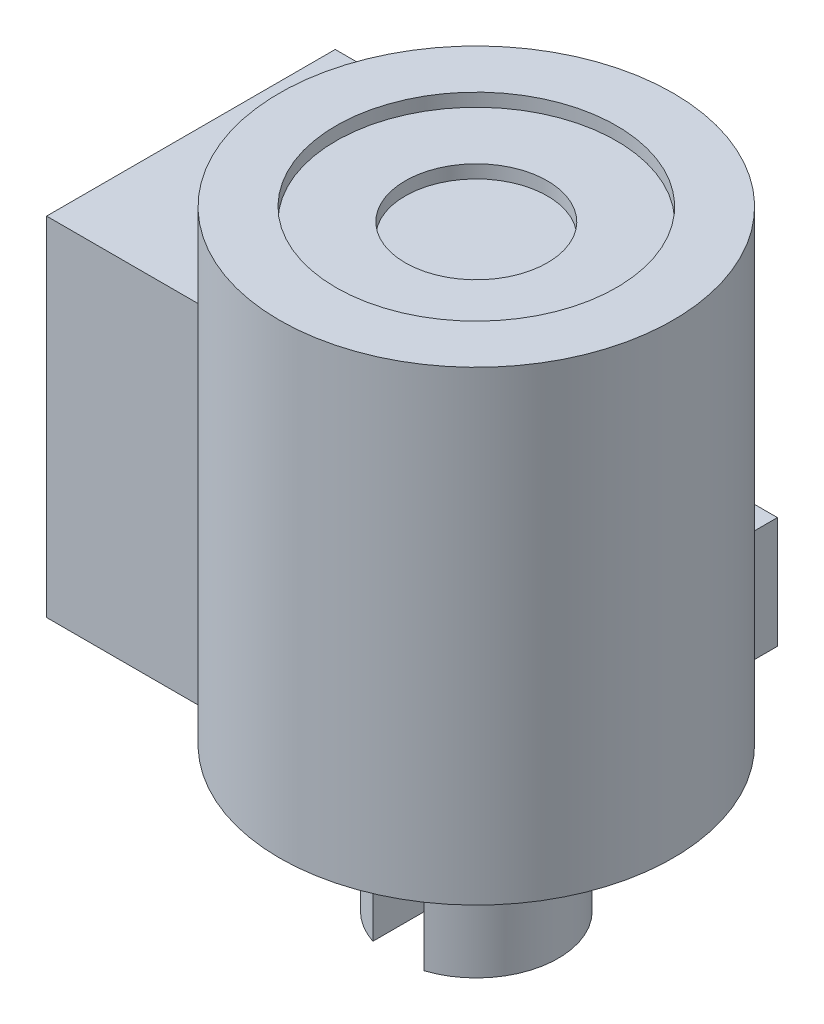
ISO-10303-21;
HEADER;
FILE_DESCRIPTION(('STEP AP214'),'2;1');
FILE_NAME('part.step','',(''),(''),'','','');
FILE_SCHEMA(('AUTOMOTIVE_DESIGN { 1 0 10303 214 1 1 1 1 }'));
ENDSEC;
DATA;
#1=APPLICATION_CONTEXT('core data for automotive mechanical design processes');
#2=APPLICATION_PROTOCOL_DEFINITION('international standard','automotive_design',2000,#1);
#3=PRODUCT_CONTEXT('',#1,'mechanical');
#4=PRODUCT('Part','Part','',(#3));
#5=PRODUCT_RELATED_PRODUCT_CATEGORY('part','',(#4));
#6=PRODUCT_DEFINITION_FORMATION('','',#4);
#7=PRODUCT_DEFINITION_CONTEXT('part definition',#1,'design');
#8=PRODUCT_DEFINITION('design','',#6,#7);
#9=PRODUCT_DEFINITION_SHAPE('','',#8);
#10=(LENGTH_UNIT() NAMED_UNIT(*) SI_UNIT(.MILLI.,.METRE.));
#11=(NAMED_UNIT(*) PLANE_ANGLE_UNIT() SI_UNIT($,.RADIAN.));
#12=(NAMED_UNIT(*) SI_UNIT($,.STERADIAN.) SOLID_ANGLE_UNIT());
#13=UNCERTAINTY_MEASURE_WITH_UNIT(LENGTH_MEASURE(1.E-05),#10,'distance_accuracy_value','');
#14=(GEOMETRIC_REPRESENTATION_CONTEXT(3) GLOBAL_UNCERTAINTY_ASSIGNED_CONTEXT((#13)) GLOBAL_UNIT_ASSIGNED_CONTEXT((#10,
#11,#12)) REPRESENTATION_CONTEXT('',''));
#15=CARTESIAN_POINT('',(0.,0.,0.));
#16=DIRECTION('',(0.,0.,1.));
#17=DIRECTION('',(1.,0.,0.));
#18=AXIS2_PLACEMENT_3D('',#15,#16,#17);
#19=CARTESIAN_POINT('',(0.,-22.,0.));
#20=DIRECTION('',(0.,-1.,0.));
#21=DIRECTION('',(0.,0.,-1.));
#22=AXIS2_PLACEMENT_3D('',#19,#20,#21);
#23=PLANE('',#22);
#24=DIRECTION('',(0.,0.,1.));
#25=VECTOR('',#24,1.);
#26=CARTESIAN_POINT('',(3.89223454555543,-22.,0.));
#27=LINE('',#26,#25);
#28=CARTESIAN_POINT('',(3.89223454555543,-22.,-11.8730520082443));
#29=VERTEX_POINT('',#28);
#30=CARTESIAN_POINT('',(3.89223454555543,-22.,11.8730520082443));
#31=VERTEX_POINT('',#30);
#32=EDGE_CURVE('E349',#29,#31,#27,.T.);
#33=ORIENTED_EDGE('',*,*,#32,.F.);
#34=CARTESIAN_POINT('',(0.,-22.,0.));
#35=DIRECTION('',(0.,-1.,0.));
#36=DIRECTION('',(0.,0.,-1.));
#37=AXIS2_PLACEMENT_3D('',#34,#35,#36);
#38=CIRCLE('',#37,12.4947530487037);
#39=EDGE_CURVE('E334',#29,#31,#38,.T.);
#40=ORIENTED_EDGE('',*,*,#39,.T.);
#41=EDGE_LOOP('',(#33,#40));
#42=FACE_BOUND('',#41,.T.);
#43=ADVANCED_FACE('F40',(#42),#23,.T.);
#44=CARTESIAN_POINT('',(0.,10.,0.));
#45=DIRECTION('',(0.,-1.,0.));
#46=DIRECTION('',(0.,0.,-1.));
#47=AXIS2_PLACEMENT_3D('',#44,#45,#46);
#48=CYLINDRICAL_SURFACE('',#47,30.);
#49=CARTESIAN_POINT('',(0.,0.,0.));
#50=DIRECTION('',(0.,1.,0.));
#51=DIRECTION('',(0.,0.,1.));
#52=AXIS2_PLACEMENT_3D('',#49,#50,#51);
#53=CIRCLE('',#52,30.);
#54=CARTESIAN_POINT('',(-10.,0.,-28.2842712474619));
#55=VERTEX_POINT('',#54);
#56=CARTESIAN_POINT('',(10.,0.,-28.2842712474619));
#57=VERTEX_POINT('',#56);
#58=EDGE_CURVE('E338',#55,#57,#53,.T.);
#59=ORIENTED_EDGE('',*,*,#58,.T.);
#60=DIRECTION('',(0.,-1.,0.));
#61=VECTOR('',#60,1.);
#62=CARTESIAN_POINT('',(10.,17.,-28.2842712474619));
#63=LINE('',#62,#61);
#64=CARTESIAN_POINT('',(10.,17.,-28.2842712474619));
#65=VERTEX_POINT('',#64);
#66=EDGE_CURVE('E277',#65,#57,#63,.T.);
#67=ORIENTED_EDGE('',*,*,#66,.F.);
#68=CARTESIAN_POINT('',(0.,17.,0.));
#69=DIRECTION('',(0.,1.,0.));
#70=DIRECTION('',(0.,0.,-1.));
#71=AXIS2_PLACEMENT_3D('',#68,#69,#70);
#72=CIRCLE('',#71,30.);
#73=CARTESIAN_POINT('',(-10.,17.,-28.2842712474619));
#74=VERTEX_POINT('',#73);
#75=EDGE_CURVE('E259',#65,#74,#72,.T.);
#76=ORIENTED_EDGE('',*,*,#75,.T.);
#77=DIRECTION('',(0.,-1.,0.));
#78=VECTOR('',#77,1.);
#79=CARTESIAN_POINT('',(-10.,17.,-28.2842712474619));
#80=LINE('',#79,#78);
#81=EDGE_CURVE('E273',#74,#55,#80,.T.);
#82=ORIENTED_EDGE('',*,*,#81,.T.);
#83=EDGE_LOOP('',(#59,#67,#76,#82));
#84=FACE_BOUND('',#83,.T.);
#85=CARTESIAN_POINT('',(0.,59.,0.));
#86=DIRECTION('',(0.,1.,0.));
#87=DIRECTION('',(0.,0.,1.));
#88=AXIS2_PLACEMENT_3D('',#85,#86,#87);
#89=CIRCLE('',#88,30.);
#90=CARTESIAN_POINT('',(-20.3960780543711,59.,-22.));
#91=VERTEX_POINT('',#90);
#92=CARTESIAN_POINT('',(-20.3960780543711,59.,22.));
#93=VERTEX_POINT('',#92);
#94=EDGE_CURVE('E174',#91,#93,#89,.T.);
#95=ORIENTED_EDGE('',*,*,#94,.T.);
#96=DIRECTION('',(0.,1.,0.));
#97=VECTOR('',#96,1.);
#98=CARTESIAN_POINT('',(-20.3960780543711,5.99999999999999,22.));
#99=LINE('',#98,#97);
#100=CARTESIAN_POINT('',(-20.3960780543711,5.99999999999999,22.));
#101=VERTEX_POINT('',#100);
#102=EDGE_CURVE('E194',#101,#93,#99,.T.);
#103=ORIENTED_EDGE('',*,*,#102,.F.);
#104=CARTESIAN_POINT('',(0.,5.99999999999999,0.));
#105=DIRECTION('',(0.,1.,0.));
#106=DIRECTION('',(0.,0.,1.));
#107=AXIS2_PLACEMENT_3D('',#104,#105,#106);
#108=CIRCLE('',#107,30.);
#109=CARTESIAN_POINT('',(-20.3960780543711,5.99999999999999,-22.));
#110=VERTEX_POINT('',#109);
#111=EDGE_CURVE('E201',#110,#101,#108,.T.);
#112=ORIENTED_EDGE('',*,*,#111,.F.);
#113=DIRECTION('',(0.,1.,0.));
#114=VECTOR('',#113,1.);
#115=CARTESIAN_POINT('',(-20.3960780543711,5.99999999999999,-22.));
#116=LINE('',#115,#114);
#117=EDGE_CURVE('E191',#110,#91,#116,.T.);
#118=ORIENTED_EDGE('',*,*,#117,.T.);
#119=EDGE_LOOP('',(#95,#103,#112,#118));
#120=FACE_BOUND('',#119,.T.);
#121=CARTESIAN_POINT('',(0.,71.,0.));
#122=DIRECTION('',(0.,1.,0.));
#123=DIRECTION('',(0.,0.,1.));
#124=AXIS2_PLACEMENT_3D('',#121,#122,#123);
#125=CIRCLE('',#124,30.);
#126=CARTESIAN_POINT('',(0.,71.,30.));
#127=VERTEX_POINT('',#126);
#128=EDGE_CURVE('E322',#127,#127,#125,.T.);
#129=ORIENTED_EDGE('',*,*,#128,.F.);
#130=EDGE_LOOP('',(#129));
#131=FACE_BOUND('',#130,.T.);
#132=ADVANCED_FACE('F42',(#84,#120,#131),#48,.T.);
#133=CARTESIAN_POINT('',(0.,0.,0.));
#134=DIRECTION('',(0.,1.,0.));
#135=DIRECTION('',(0.,0.,1.));
#136=AXIS2_PLACEMENT_3D('',#133,#134,#135);
#137=PLANE('',#136);
#138=DIRECTION('',(-1.,0.,0.));
#139=VECTOR('',#138,1.);
#140=CARTESIAN_POINT('',(8.7341284267719,0.,-30.303567602747));
#141=LINE('',#140,#139);
#142=CARTESIAN_POINT('',(8.7341284267719,0.,-30.303567602747));
#143=VERTEX_POINT('',#142);
#144=CARTESIAN_POINT('',(-9.17731905281194,0.,-30.303567602747));
#145=VERTEX_POINT('',#144);
#146=EDGE_CURVE('E224',#143,#145,#141,.T.);
#147=ORIENTED_EDGE('',*,*,#146,.F.);
#148=DIRECTION('',(0.,0.,1.));
#149=VECTOR('',#148,1.);
#150=CARTESIAN_POINT('',(8.7341284267719,0.,-35.0338279399303));
#151=LINE('',#150,#149);
#152=CARTESIAN_POINT('',(8.7341284267719,0.,-35.0338279399303));
#153=VERTEX_POINT('',#152);
#154=EDGE_CURVE('E65',#153,#143,#151,.T.);
#155=ORIENTED_EDGE('',*,*,#154,.F.);
#156=DIRECTION('',(1.,0.,0.));
#157=VECTOR('',#156,1.);
#158=CARTESIAN_POINT('',(8.7341284267719,0.,-35.0338279399303));
#159=LINE('',#158,#157);
#160=CARTESIAN_POINT('',(-9.17731905281194,0.,-35.0338279399303));
#161=VERTEX_POINT('',#160);
#162=EDGE_CURVE('E209',#161,#153,#159,.T.);
#163=ORIENTED_EDGE('',*,*,#162,.F.);
#164=DIRECTION('',(0.,0.,-1.));
#165=VECTOR('',#164,1.);
#166=CARTESIAN_POINT('',(-9.17731905281194,0.,-35.0338279399303));
#167=LINE('',#166,#165);
#168=EDGE_CURVE('E228',#145,#161,#167,.T.);
#169=ORIENTED_EDGE('',*,*,#168,.F.);
#170=EDGE_LOOP('',(#147,#155,#163,#169));
#171=FACE_BOUND('',#170,.T.);
#172=CARTESIAN_POINT('',(0.,0.,0.));
#173=DIRECTION('',(0.,-1.,0.));
#174=DIRECTION('',(0.,0.,-1.));
#175=AXIS2_PLACEMENT_3D('',#172,#173,#174);
#176=CIRCLE('',#175,12.4947530487037);
#177=CARTESIAN_POINT('',(0.,0.,-12.4947530487037));
#178=VERTEX_POINT('',#177);
#179=EDGE_CURVE('E339',#178,#178,#176,.T.);
#180=ORIENTED_EDGE('',*,*,#179,.F.);
#181=EDGE_LOOP('',(#180));
#182=FACE_BOUND('',#181,.T.);
#183=ORIENTED_EDGE('',*,*,#58,.F.);
#184=DIRECTION('',(0.,0.,-1.));
#185=VECTOR('',#184,1.);
#186=CARTESIAN_POINT('',(-10.,0.,-30.));
#187=LINE('',#186,#185);
#188=CARTESIAN_POINT('',(-10.,0.,-35.9017394946788));
#189=VERTEX_POINT('',#188);
#190=EDGE_CURVE('E238',#55,#189,#187,.T.);
#191=ORIENTED_EDGE('',*,*,#190,.T.);
#192=DIRECTION('',(1.,0.,0.));
#193=VECTOR('',#192,1.);
#194=CARTESIAN_POINT('',(-10.,0.,-35.9017394946788));
#195=LINE('',#194,#193);
#196=CARTESIAN_POINT('',(10.,0.,-35.9017394946788));
#197=VERTEX_POINT('',#196);
#198=EDGE_CURVE('E266',#189,#197,#195,.T.);
#199=ORIENTED_EDGE('',*,*,#198,.T.);
#200=DIRECTION('',(0.,0.,1.));
#201=VECTOR('',#200,1.);
#202=CARTESIAN_POINT('',(10.,0.,-30.));
#203=LINE('',#202,#201);
#204=EDGE_CURVE('E251',#197,#57,#203,.T.);
#205=ORIENTED_EDGE('',*,*,#204,.T.);
#206=EDGE_LOOP('',(#183,#191,#199,#205));
#207=FACE_BOUND('',#206,.T.);
#208=ADVANCED_FACE('F376',(#171,#182,#207),#137,.F.);
#209=CARTESIAN_POINT('',(0.,-22.,0.));
#210=DIRECTION('',(0.,1.,0.));
#211=DIRECTION('',(0.,0.,1.));
#212=AXIS2_PLACEMENT_3D('',#209,#210,#211);
#213=CYLINDRICAL_SURFACE('',#212,12.4947530487037);
#214=ORIENTED_EDGE('',*,*,#39,.F.);
#215=DIRECTION('',(0.,1.,0.));
#216=VECTOR('',#215,1.);
#217=CARTESIAN_POINT('',(3.89223454555543,-22.,-11.8730520082443));
#218=LINE('',#217,#216);
#219=CARTESIAN_POINT('',(3.89223454555543,-5.,-11.8730520082443));
#220=VERTEX_POINT('',#219);
#221=EDGE_CURVE('E305',#29,#220,#218,.T.);
#222=ORIENTED_EDGE('',*,*,#221,.T.);
#223=CARTESIAN_POINT('',(0.,-5.,0.));
#224=DIRECTION('',(0.,1.,0.));
#225=DIRECTION('',(0.,0.,1.));
#226=AXIS2_PLACEMENT_3D('',#223,#224,#225);
#227=CIRCLE('',#226,12.4947530487037);
#228=CARTESIAN_POINT('',(-3.89223454555543,-5.,-11.8730520082443));
#229=VERTEX_POINT('',#228);
#230=EDGE_CURVE('E50',#220,#229,#227,.T.);
#231=ORIENTED_EDGE('',*,*,#230,.T.);
#232=DIRECTION('',(0.,1.,0.));
#233=VECTOR('',#232,1.);
#234=CARTESIAN_POINT('',(-3.89223454555543,-22.,-11.8730520082443));
#235=LINE('',#234,#233);
#236=CARTESIAN_POINT('',(-3.89223454555543,-22.,-11.8730520082443));
#237=VERTEX_POINT('',#236);
#238=EDGE_CURVE('E293',#229,#237,#235,.F.);
#239=ORIENTED_EDGE('',*,*,#238,.T.);
#240=CARTESIAN_POINT('',(-3.89223454555543,-22.,11.8730520082443));
#241=VERTEX_POINT('',#240);
#242=EDGE_CURVE('E333',#241,#237,#38,.T.);
#243=ORIENTED_EDGE('',*,*,#242,.F.);
#244=DIRECTION('',(0.,1.,0.));
#245=VECTOR('',#244,1.);
#246=CARTESIAN_POINT('',(-3.89223454555543,-22.,11.8730520082443));
#247=LINE('',#246,#245);
#248=CARTESIAN_POINT('',(-3.89223454555543,-5.,11.8730520082443));
#249=VERTEX_POINT('',#248);
#250=EDGE_CURVE('E297',#241,#249,#247,.T.);
#251=ORIENTED_EDGE('',*,*,#250,.T.);
#252=CARTESIAN_POINT('',(3.89223454555543,-5.,11.8730520082443));
#253=VERTEX_POINT('',#252);
#254=EDGE_CURVE('E351',#249,#253,#227,.T.);
#255=ORIENTED_EDGE('',*,*,#254,.T.);
#256=DIRECTION('',(0.,1.,0.));
#257=VECTOR('',#256,1.);
#258=CARTESIAN_POINT('',(3.89223454555543,-22.,11.8730520082443));
#259=LINE('',#258,#257);
#260=EDGE_CURVE('E301',#253,#31,#259,.F.);
#261=ORIENTED_EDGE('',*,*,#260,.T.);
#262=EDGE_LOOP('',(#214,#222,#231,#239,#243,#251,#255,#261));
#263=FACE_BOUND('',#262,.T.);
#264=ORIENTED_EDGE('',*,*,#179,.T.);
#265=EDGE_LOOP('',(#264));
#266=FACE_BOUND('',#265,.T.);
#267=ADVANCED_FACE('F358',(#263,#266),#213,.T.);
#268=DIRECTION('',(0.,0.,-1.));
#269=VECTOR('',#268,1.);
#270=CARTESIAN_POINT('',(-3.89223454555543,-22.,0.));
#271=LINE('',#270,#269);
#272=EDGE_CURVE('E343',#241,#237,#271,.T.);
#273=ORIENTED_EDGE('',*,*,#272,.F.);
#274=ORIENTED_EDGE('',*,*,#242,.T.);
#275=EDGE_LOOP('',(#273,#274));
#276=FACE_BOUND('',#275,.T.);
#277=ADVANCED_FACE('F372',(#276),#23,.T.);
#278=CARTESIAN_POINT('',(0.,71.,0.));
#279=DIRECTION('',(0.,1.,0.));
#280=DIRECTION('',(0.,0.,1.));
#281=AXIS2_PLACEMENT_3D('',#278,#279,#280);
#282=PLANE('',#281);
#283=CARTESIAN_POINT('',(0.,71.,0.));
#284=DIRECTION('',(0.,1.,0.));
#285=DIRECTION('',(0.,0.,1.));
#286=AXIS2_PLACEMENT_3D('',#283,#284,#285);
#287=CIRCLE('',#286,21.3823266492261);
#288=CARTESIAN_POINT('',(0.,71.,21.3823266492261));
#289=VERTEX_POINT('',#288);
#290=EDGE_CURVE('E314',#289,#289,#287,.T.);
#291=ORIENTED_EDGE('',*,*,#290,.F.);
#292=EDGE_LOOP('',(#291));
#293=FACE_BOUND('',#292,.T.);
#294=ORIENTED_EDGE('',*,*,#128,.T.);
#295=EDGE_LOOP('',(#294));
#296=FACE_BOUND('',#295,.T.);
#297=ADVANCED_FACE('F381',(#293,#296),#282,.T.);
#298=CARTESIAN_POINT('',(0.,69.,0.));
#299=DIRECTION('',(0.,1.,0.));
#300=DIRECTION('',(0.,0.,1.));
#301=AXIS2_PLACEMENT_3D('',#298,#299,#300);
#302=CYLINDRICAL_SURFACE('',#301,21.3823266492261);
#303=CARTESIAN_POINT('',(0.,69.,0.));
#304=DIRECTION('',(0.,1.,0.));
#305=DIRECTION('',(0.,0.,1.));
#306=AXIS2_PLACEMENT_3D('',#303,#304,#305);
#307=CIRCLE('',#306,21.3823266492261);
#308=CARTESIAN_POINT('',(0.,69.,21.3823266492261));
#309=VERTEX_POINT('',#308);
#310=EDGE_CURVE('E318',#309,#309,#307,.T.);
#311=ORIENTED_EDGE('',*,*,#310,.F.);
#312=EDGE_LOOP('',(#311));
#313=FACE_BOUND('',#312,.T.);
#314=ORIENTED_EDGE('',*,*,#290,.T.);
#315=EDGE_LOOP('',(#314));
#316=FACE_BOUND('',#315,.T.);
#317=ADVANCED_FACE('F387',(#313,#316),#302,.F.);
#318=CARTESIAN_POINT('',(0.,69.,0.));
#319=DIRECTION('',(0.,1.,0.));
#320=DIRECTION('',(0.,0.,1.));
#321=AXIS2_PLACEMENT_3D('',#318,#319,#320);
#322=PLANE('',#321);
#323=CARTESIAN_POINT('',(0.,69.,0.));
#324=DIRECTION('',(0.,1.,0.));
#325=DIRECTION('',(0.,0.,1.));
#326=AXIS2_PLACEMENT_3D('',#323,#324,#325);
#327=CIRCLE('',#326,10.833594828842);
#328=CARTESIAN_POINT('',(0.,69.,10.833594828842));
#329=VERTEX_POINT('',#328);
#330=EDGE_CURVE('E309',#329,#329,#327,.T.);
#331=ORIENTED_EDGE('',*,*,#330,.F.);
#332=EDGE_LOOP('',(#331));
#333=FACE_BOUND('',#332,.T.);
#334=ORIENTED_EDGE('',*,*,#310,.T.);
#335=EDGE_LOOP('',(#334));
#336=FACE_BOUND('',#335,.T.);
#337=ADVANCED_FACE('F415',(#333,#336),#322,.T.);
#338=CARTESIAN_POINT('',(0.,67.,0.));
#339=DIRECTION('',(0.,1.,0.));
#340=DIRECTION('',(0.,0.,1.));
#341=AXIS2_PLACEMENT_3D('',#338,#339,#340);
#342=CYLINDRICAL_SURFACE('',#341,10.833594828842);
#343=CARTESIAN_POINT('',(0.,67.,0.));
#344=DIRECTION('',(0.,1.,0.));
#345=DIRECTION('',(0.,0.,1.));
#346=AXIS2_PLACEMENT_3D('',#343,#344,#345);
#347=CIRCLE('',#346,10.833594828842);
#348=CARTESIAN_POINT('',(0.,67.,10.833594828842));
#349=VERTEX_POINT('',#348);
#350=EDGE_CURVE('E310',#349,#349,#347,.T.);
#351=ORIENTED_EDGE('',*,*,#350,.F.);
#352=EDGE_LOOP('',(#351));
#353=FACE_BOUND('',#352,.T.);
#354=ORIENTED_EDGE('',*,*,#330,.T.);
#355=EDGE_LOOP('',(#354));
#356=FACE_BOUND('',#355,.T.);
#357=ADVANCED_FACE('F411',(#353,#356),#342,.F.);
#358=CARTESIAN_POINT('',(0.,67.,0.));
#359=DIRECTION('',(0.,1.,0.));
#360=DIRECTION('',(0.,0.,1.));
#361=AXIS2_PLACEMENT_3D('',#358,#359,#360);
#362=PLANE('',#361);
#363=ORIENTED_EDGE('',*,*,#350,.T.);
#364=EDGE_LOOP('',(#363));
#365=FACE_BOUND('',#364,.T.);
#366=ADVANCED_FACE('F408',(#365),#362,.T.);
#367=CARTESIAN_POINT('',(0.,-5.,0.));
#368=DIRECTION('',(0.,1.,0.));
#369=DIRECTION('',(0.,0.,1.));
#370=AXIS2_PLACEMENT_3D('',#367,#368,#369);
#371=PLANE('',#370);
#372=DIRECTION('',(0.,0.,1.));
#373=VECTOR('',#372,1.);
#374=CARTESIAN_POINT('',(3.89223454555543,-5.,-16.5212934433686));
#375=LINE('',#374,#373);
#376=EDGE_CURVE('E276',#220,#253,#375,.T.);
#377=ORIENTED_EDGE('',*,*,#376,.T.);
#378=ORIENTED_EDGE('',*,*,#254,.F.);
#379=DIRECTION('',(0.,0.,-1.));
#380=VECTOR('',#379,1.);
#381=CARTESIAN_POINT('',(-3.89223454555543,-5.,-16.5212934433686));
#382=LINE('',#381,#380);
#383=EDGE_CURVE('E289',#249,#229,#382,.T.);
#384=ORIENTED_EDGE('',*,*,#383,.T.);
#385=ORIENTED_EDGE('',*,*,#230,.F.);
#386=EDGE_LOOP('',(#377,#378,#384,#385));
#387=FACE_BOUND('',#386,.T.);
#388=ADVANCED_FACE('F364',(#387),#371,.F.);
#389=CARTESIAN_POINT('',(3.89223454555543,-5.,-16.5212934433686));
#390=DIRECTION('',(1.,0.,0.));
#391=DIRECTION('',(0.,0.,-1.));
#392=AXIS2_PLACEMENT_3D('',#389,#390,#391);
#393=PLANE('',#392);
#394=ORIENTED_EDGE('',*,*,#32,.T.);
#395=ORIENTED_EDGE('',*,*,#260,.F.);
#396=ORIENTED_EDGE('',*,*,#376,.F.);
#397=ORIENTED_EDGE('',*,*,#221,.F.);
#398=EDGE_LOOP('',(#394,#395,#396,#397));
#399=FACE_BOUND('',#398,.T.);
#400=ADVANCED_FACE('F367',(#399),#393,.F.);
#401=CARTESIAN_POINT('',(-3.89223454555543,-5.,-16.5212934433686));
#402=DIRECTION('',(-1.,0.,0.));
#403=DIRECTION('',(0.,0.,1.));
#404=AXIS2_PLACEMENT_3D('',#401,#402,#403);
#405=PLANE('',#404);
#406=ORIENTED_EDGE('',*,*,#272,.T.);
#407=ORIENTED_EDGE('',*,*,#238,.F.);
#408=ORIENTED_EDGE('',*,*,#383,.F.);
#409=ORIENTED_EDGE('',*,*,#250,.F.);
#410=EDGE_LOOP('',(#406,#407,#408,#409));
#411=FACE_BOUND('',#410,.T.);
#412=ADVANCED_FACE('F393',(#411),#405,.F.);
#413=CARTESIAN_POINT('',(10.,17.,-30.));
#414=DIRECTION('',(1.,0.,0.));
#415=DIRECTION('',(0.,0.,-1.));
#416=AXIS2_PLACEMENT_3D('',#413,#414,#415);
#417=PLANE('',#416);
#418=ORIENTED_EDGE('',*,*,#204,.F.);
#419=DIRECTION('',(0.,-1.,0.));
#420=VECTOR('',#419,1.);
#421=CARTESIAN_POINT('',(10.,17.,-35.9017394946788));
#422=LINE('',#421,#420);
#423=CARTESIAN_POINT('',(10.,17.,-35.9017394946788));
#424=VERTEX_POINT('',#423);
#425=EDGE_CURVE('E280',#424,#197,#422,.T.);
#426=ORIENTED_EDGE('',*,*,#425,.F.);
#427=DIRECTION('',(0.,0.,1.));
#428=VECTOR('',#427,1.);
#429=CARTESIAN_POINT('',(10.,17.,-30.));
#430=LINE('',#429,#428);
#431=EDGE_CURVE('E255',#424,#65,#430,.T.);
#432=ORIENTED_EDGE('',*,*,#431,.T.);
#433=ORIENTED_EDGE('',*,*,#66,.T.);
#434=EDGE_LOOP('',(#418,#426,#432,#433));
#435=FACE_BOUND('',#434,.T.);
#436=ADVANCED_FACE('F395',(#435),#417,.T.);
#437=CARTESIAN_POINT('',(-10.,17.,-35.9017394946788));
#438=DIRECTION('',(0.,0.,-1.));
#439=DIRECTION('',(-1.,0.,0.));
#440=AXIS2_PLACEMENT_3D('',#437,#438,#439);
#441=PLANE('',#440);
#442=ORIENTED_EDGE('',*,*,#198,.F.);
#443=DIRECTION('',(0.,-1.,0.));
#444=VECTOR('',#443,1.);
#445=CARTESIAN_POINT('',(-10.,17.,-35.9017394946788));
#446=LINE('',#445,#444);
#447=CARTESIAN_POINT('',(-10.,17.,-35.9017394946788));
#448=VERTEX_POINT('',#447);
#449=EDGE_CURVE('E262',#448,#189,#446,.T.);
#450=ORIENTED_EDGE('',*,*,#449,.F.);
#451=DIRECTION('',(1.,0.,0.));
#452=VECTOR('',#451,1.);
#453=CARTESIAN_POINT('',(-10.,17.,-35.9017394946788));
#454=LINE('',#453,#452);
#455=EDGE_CURVE('E250',#448,#424,#454,.T.);
#456=ORIENTED_EDGE('',*,*,#455,.T.);
#457=ORIENTED_EDGE('',*,*,#425,.T.);
#458=EDGE_LOOP('',(#442,#450,#456,#457));
#459=FACE_BOUND('',#458,.T.);
#460=ADVANCED_FACE('F401',(#459),#441,.T.);
#461=CARTESIAN_POINT('',(-10.,17.,-30.));
#462=DIRECTION('',(-1.,0.,0.));
#463=DIRECTION('',(0.,0.,1.));
#464=AXIS2_PLACEMENT_3D('',#461,#462,#463);
#465=PLANE('',#464);
#466=ORIENTED_EDGE('',*,*,#190,.F.);
#467=ORIENTED_EDGE('',*,*,#81,.F.);
#468=DIRECTION('',(0.,0.,-1.));
#469=VECTOR('',#468,1.);
#470=CARTESIAN_POINT('',(-10.,17.,-30.));
#471=LINE('',#470,#469);
#472=EDGE_CURVE('E247',#74,#448,#471,.T.);
#473=ORIENTED_EDGE('',*,*,#472,.T.);
#474=ORIENTED_EDGE('',*,*,#449,.T.);
#475=EDGE_LOOP('',(#466,#467,#473,#474));
#476=FACE_BOUND('',#475,.T.);
#477=ADVANCED_FACE('F476',(#476),#465,.T.);
#478=CARTESIAN_POINT('',(0.,17.,0.));
#479=DIRECTION('',(0.,-1.,0.));
#480=DIRECTION('',(0.,0.,-1.));
#481=AXIS2_PLACEMENT_3D('',#478,#479,#480);
#482=PLANE('',#481);
#483=ORIENTED_EDGE('',*,*,#472,.F.);
#484=ORIENTED_EDGE('',*,*,#75,.F.);
#485=ORIENTED_EDGE('',*,*,#431,.F.);
#486=ORIENTED_EDGE('',*,*,#455,.F.);
#487=EDGE_LOOP('',(#483,#484,#485,#486));
#488=FACE_BOUND('',#487,.T.);
#489=ADVANCED_FACE('F474',(#488),#482,.F.);
#490=CARTESIAN_POINT('',(8.7341284267719,14.,-35.0338279399303));
#491=DIRECTION('',(1.,0.,0.));
#492=DIRECTION('',(0.,0.,-1.));
#493=AXIS2_PLACEMENT_3D('',#490,#491,#492);
#494=PLANE('',#493);
#495=ORIENTED_EDGE('',*,*,#154,.T.);
#496=DIRECTION('',(0.,-1.,0.));
#497=VECTOR('',#496,1.);
#498=CARTESIAN_POINT('',(8.7341284267719,14.,-30.303567602747));
#499=LINE('',#498,#497);
#500=CARTESIAN_POINT('',(8.7341284267719,14.,-30.303567602747));
#501=VERTEX_POINT('',#500);
#502=EDGE_CURVE('E221',#501,#143,#499,.T.);
#503=ORIENTED_EDGE('',*,*,#502,.F.);
#504=DIRECTION('',(0.,0.,1.));
#505=VECTOR('',#504,1.);
#506=CARTESIAN_POINT('',(8.7341284267719,14.,-35.0338279399303));
#507=LINE('',#506,#505);
#508=CARTESIAN_POINT('',(8.7341284267719,14.,-35.0338279399303));
#509=VERTEX_POINT('',#508);
#510=EDGE_CURVE('E204',#509,#501,#507,.T.);
#511=ORIENTED_EDGE('',*,*,#510,.F.);
#512=DIRECTION('',(0.,-1.,0.));
#513=VECTOR('',#512,1.);
#514=CARTESIAN_POINT('',(8.7341284267719,14.,-35.0338279399303));
#515=LINE('',#514,#513);
#516=EDGE_CURVE('E235',#509,#153,#515,.T.);
#517=ORIENTED_EDGE('',*,*,#516,.T.);
#518=EDGE_LOOP('',(#495,#503,#511,#517));
#519=FACE_BOUND('',#518,.T.);
#520=ADVANCED_FACE('F464',(#519),#494,.F.);
#521=CARTESIAN_POINT('',(8.7341284267719,14.,-35.0338279399303));
#522=DIRECTION('',(0.,0.,-1.));
#523=DIRECTION('',(-1.,0.,0.));
#524=AXIS2_PLACEMENT_3D('',#521,#522,#523);
#525=PLANE('',#524);
#526=ORIENTED_EDGE('',*,*,#162,.T.);
#527=ORIENTED_EDGE('',*,*,#516,.F.);
#528=DIRECTION('',(1.,0.,0.));
#529=VECTOR('',#528,1.);
#530=CARTESIAN_POINT('',(8.7341284267719,14.,-35.0338279399303));
#531=LINE('',#530,#529);
#532=CARTESIAN_POINT('',(-9.17731905281194,14.,-35.0338279399303));
#533=VERTEX_POINT('',#532);
#534=EDGE_CURVE('E217',#533,#509,#531,.T.);
#535=ORIENTED_EDGE('',*,*,#534,.F.);
#536=DIRECTION('',(0.,-1.,0.));
#537=VECTOR('',#536,1.);
#538=CARTESIAN_POINT('',(-9.17731905281194,14.,-35.0338279399303));
#539=LINE('',#538,#537);
#540=EDGE_CURVE('E239',#533,#161,#539,.T.);
#541=ORIENTED_EDGE('',*,*,#540,.T.);
#542=EDGE_LOOP('',(#526,#527,#535,#541));
#543=FACE_BOUND('',#542,.T.);
#544=ADVANCED_FACE('F460',(#543),#525,.F.);
#545=CARTESIAN_POINT('',(-9.17731905281194,14.,-35.0338279399303));
#546=DIRECTION('',(-1.,0.,0.));
#547=DIRECTION('',(0.,0.,1.));
#548=AXIS2_PLACEMENT_3D('',#545,#546,#547);
#549=PLANE('',#548);
#550=ORIENTED_EDGE('',*,*,#168,.T.);
#551=ORIENTED_EDGE('',*,*,#540,.F.);
#552=DIRECTION('',(0.,0.,-1.));
#553=VECTOR('',#552,1.);
#554=CARTESIAN_POINT('',(-9.17731905281194,14.,-35.0338279399303));
#555=LINE('',#554,#553);
#556=CARTESIAN_POINT('',(-9.17731905281194,14.,-30.303567602747));
#557=VERTEX_POINT('',#556);
#558=EDGE_CURVE('E213',#557,#533,#555,.T.);
#559=ORIENTED_EDGE('',*,*,#558,.F.);
#560=DIRECTION('',(0.,-1.,0.));
#561=VECTOR('',#560,1.);
#562=CARTESIAN_POINT('',(-9.17731905281194,14.,-30.303567602747));
#563=LINE('',#562,#561);
#564=EDGE_CURVE('E242',#557,#145,#563,.T.);
#565=ORIENTED_EDGE('',*,*,#564,.T.);
#566=EDGE_LOOP('',(#550,#551,#559,#565));
#567=FACE_BOUND('',#566,.T.);
#568=ADVANCED_FACE('F463',(#567),#549,.F.);
#569=CARTESIAN_POINT('',(8.7341284267719,14.,-30.303567602747));
#570=DIRECTION('',(0.,0.,1.));
#571=DIRECTION('',(1.,0.,0.));
#572=AXIS2_PLACEMENT_3D('',#569,#570,#571);
#573=PLANE('',#572);
#574=ORIENTED_EDGE('',*,*,#146,.T.);
#575=ORIENTED_EDGE('',*,*,#564,.F.);
#576=DIRECTION('',(-1.,0.,0.));
#577=VECTOR('',#576,1.);
#578=CARTESIAN_POINT('',(8.7341284267719,14.,-30.303567602747));
#579=LINE('',#578,#577);
#580=EDGE_CURVE('E208',#501,#557,#579,.T.);
#581=ORIENTED_EDGE('',*,*,#580,.F.);
#582=ORIENTED_EDGE('',*,*,#502,.T.);
#583=EDGE_LOOP('',(#574,#575,#581,#582));
#584=FACE_BOUND('',#583,.T.);
#585=ADVANCED_FACE('F458',(#584),#573,.F.);
#586=CARTESIAN_POINT('',(0.,14.,0.));
#587=DIRECTION('',(0.,-1.,0.));
#588=DIRECTION('',(0.,0.,-1.));
#589=AXIS2_PLACEMENT_3D('',#586,#587,#588);
#590=PLANE('',#589);
#591=ORIENTED_EDGE('',*,*,#510,.T.);
#592=ORIENTED_EDGE('',*,*,#580,.T.);
#593=ORIENTED_EDGE('',*,*,#558,.T.);
#594=ORIENTED_EDGE('',*,*,#534,.T.);
#595=EDGE_LOOP('',(#591,#592,#593,#594));
#596=FACE_BOUND('',#595,.T.);
#597=ADVANCED_FACE('F454',(#596),#590,.T.);
#598=CARTESIAN_POINT('',(0.,5.99999999999999,0.));
#599=DIRECTION('',(0.,1.,0.));
#600=DIRECTION('',(0.,0.,1.));
#601=AXIS2_PLACEMENT_3D('',#598,#599,#600);
#602=PLANE('',#601);
#603=DIRECTION('',(-1.,0.,0.));
#604=VECTOR('',#603,1.);
#605=CARTESIAN_POINT('',(-30.,5.99999999999999,-22.));
#606=LINE('',#605,#604);
#607=CARTESIAN_POINT('',(-43.5077155994841,5.99999999999999,-22.));
#608=VERTEX_POINT('',#607);
#609=EDGE_CURVE('E162',#110,#608,#606,.T.);
#610=ORIENTED_EDGE('',*,*,#609,.F.);
#611=ORIENTED_EDGE('',*,*,#111,.T.);
#612=DIRECTION('',(1.,0.,0.));
#613=VECTOR('',#612,1.);
#614=CARTESIAN_POINT('',(-30.,5.99999999999999,22.));
#615=LINE('',#614,#613);
#616=CARTESIAN_POINT('',(-43.5077155994841,5.99999999999999,22.));
#617=VERTEX_POINT('',#616);
#618=EDGE_CURVE('E169',#617,#101,#615,.T.);
#619=ORIENTED_EDGE('',*,*,#618,.F.);
#620=DIRECTION('',(0.,0.,1.));
#621=VECTOR('',#620,1.);
#622=CARTESIAN_POINT('',(-43.5077155994841,5.99999999999999,-22.));
#623=LINE('',#622,#621);
#624=EDGE_CURVE('E185',#608,#617,#623,.T.);
#625=ORIENTED_EDGE('',*,*,#624,.F.);
#626=EDGE_LOOP('',(#610,#611,#619,#625));
#627=FACE_BOUND('',#626,.T.);
#628=ADVANCED_FACE('F457',(#627),#602,.F.);
#629=CARTESIAN_POINT('',(-30.,5.99999999999999,22.));
#630=DIRECTION('',(0.,0.,1.));
#631=DIRECTION('',(1.,0.,0.));
#632=AXIS2_PLACEMENT_3D('',#629,#630,#631);
#633=PLANE('',#632);
#634=ORIENTED_EDGE('',*,*,#102,.T.);
#635=DIRECTION('',(1.,0.,0.));
#636=VECTOR('',#635,1.);
#637=CARTESIAN_POINT('',(-30.,59.,22.));
#638=LINE('',#637,#636);
#639=CARTESIAN_POINT('',(-43.5077155994841,59.,22.));
#640=VERTEX_POINT('',#639);
#641=EDGE_CURVE('E57',#640,#93,#638,.T.);
#642=ORIENTED_EDGE('',*,*,#641,.F.);
#643=DIRECTION('',(0.,1.,0.));
#644=VECTOR('',#643,1.);
#645=CARTESIAN_POINT('',(-43.5077155994841,5.99999999999999,22.));
#646=LINE('',#645,#644);
#647=EDGE_CURVE('E168',#617,#640,#646,.T.);
#648=ORIENTED_EDGE('',*,*,#647,.F.);
#649=ORIENTED_EDGE('',*,*,#618,.T.);
#650=EDGE_LOOP('',(#634,#642,#648,#649));
#651=FACE_BOUND('',#650,.T.);
#652=ADVANCED_FACE('F450',(#651),#633,.T.);
#653=CARTESIAN_POINT('',(-43.5077155994841,5.99999999999999,-22.));
#654=DIRECTION('',(-1.,0.,0.));
#655=DIRECTION('',(0.,0.,1.));
#656=AXIS2_PLACEMENT_3D('',#653,#654,#655);
#657=PLANE('',#656);
#658=ORIENTED_EDGE('',*,*,#647,.T.);
#659=DIRECTION('',(0.,0.,1.));
#660=VECTOR('',#659,1.);
#661=CARTESIAN_POINT('',(-43.5077155994841,59.,-22.));
#662=LINE('',#661,#660);
#663=CARTESIAN_POINT('',(-43.5077155994841,59.,-22.));
#664=VERTEX_POINT('',#663);
#665=EDGE_CURVE('E172',#664,#640,#662,.T.);
#666=ORIENTED_EDGE('',*,*,#665,.F.);
#667=DIRECTION('',(0.,1.,0.));
#668=VECTOR('',#667,1.);
#669=CARTESIAN_POINT('',(-43.5077155994841,5.99999999999999,-22.));
#670=LINE('',#669,#668);
#671=EDGE_CURVE('E156',#608,#664,#670,.T.);
#672=ORIENTED_EDGE('',*,*,#671,.F.);
#673=ORIENTED_EDGE('',*,*,#624,.T.);
#674=EDGE_LOOP('',(#658,#666,#672,#673));
#675=FACE_BOUND('',#674,.T.);
#676=ADVANCED_FACE('F177',(#675),#657,.T.);
#677=CARTESIAN_POINT('',(-30.,5.99999999999999,-22.));
#678=DIRECTION('',(0.,0.,-1.));
#679=DIRECTION('',(-1.,0.,0.));
#680=AXIS2_PLACEMENT_3D('',#677,#678,#679);
#681=PLANE('',#680);
#682=ORIENTED_EDGE('',*,*,#671,.T.);
#683=DIRECTION('',(-1.,0.,0.));
#684=VECTOR('',#683,1.);
#685=CARTESIAN_POINT('',(-30.,59.,-22.));
#686=LINE('',#685,#684);
#687=EDGE_CURVE('E159',#91,#664,#686,.T.);
#688=ORIENTED_EDGE('',*,*,#687,.F.);
#689=ORIENTED_EDGE('',*,*,#117,.F.);
#690=ORIENTED_EDGE('',*,*,#609,.T.);
#691=EDGE_LOOP('',(#682,#688,#689,#690));
#692=FACE_BOUND('',#691,.T.);
#693=ADVANCED_FACE('F158',(#692),#681,.T.);
#694=CARTESIAN_POINT('',(0.,59.,0.));
#695=DIRECTION('',(0.,1.,0.));
#696=DIRECTION('',(0.,0.,1.));
#697=AXIS2_PLACEMENT_3D('',#694,#695,#696);
#698=PLANE('',#697);
#699=ORIENTED_EDGE('',*,*,#94,.F.);
#700=ORIENTED_EDGE('',*,*,#687,.T.);
#701=ORIENTED_EDGE('',*,*,#665,.T.);
#702=ORIENTED_EDGE('',*,*,#641,.T.);
#703=EDGE_LOOP('',(#699,#700,#701,#702));
#704=FACE_BOUND('',#703,.T.);
#705=ADVANCED_FACE('F171',(#704),#698,.T.);
#706=CLOSED_SHELL('',(#43,#132,#208,#267,#277,#297,#317,#337,#357,#366,#388,#400,#412,#436,#460,
#477,#489,#520,#544,#568,#585,#597,#628,#652,#676,#693,#705));
#707=CARTESIAN_POINT('',(0.,61.,0.));
#708=DIRECTION('',(0.,-1.,0.));
#709=DIRECTION('',(0.,0.,-1.));
#710=AXIS2_PLACEMENT_3D('',#707,#708,#709);
#711=CYLINDRICAL_SURFACE('',#710,18.3358402047349);
#712=CARTESIAN_POINT('',(0.,59.,0.));
#713=DIRECTION('',(0.,1.,0.));
#714=DIRECTION('',(0.,0.,1.));
#715=AXIS2_PLACEMENT_3D('',#712,#713,#714);
#716=CIRCLE('',#715,18.3358402047349);
#717=CARTESIAN_POINT('',(0.,59.,-18.3358402047349));
#718=VERTEX_POINT('',#717);
#719=EDGE_CURVE('E11',#718,#718,#716,.T.);
#720=CARTESIAN_POINT('',(0.,61.,0.));
#721=DIRECTION('',(0.,1.,0.));
#722=DIRECTION('',(0.,0.,1.));
#723=AXIS2_PLACEMENT_3D('',#720,#721,#722);
#724=CIRCLE('',#723,18.3358402047349);
#725=CARTESIAN_POINT('',(0.,61.,-18.3358402047349));
#726=VERTEX_POINT('',#725);
#727=EDGE_CURVE('E329',#726,#726,#724,.T.);
#728=CARTESIAN_POINT('',(0.,59.,-18.3358402047349));
#729=CARTESIAN_POINT('',(0.,59.0208333333333,-18.3358402047349));
#730=CARTESIAN_POINT('',(0.,59.0416666666667,-18.3358402047349));
#731=CARTESIAN_POINT('',(0.,59.0833333333333,-18.3358402047349));
#732=CARTESIAN_POINT('',(0.,59.1041666666667,-18.3358402047349));
#733=CARTESIAN_POINT('',(0.,59.1458333333333,-18.3358402047349));
#734=CARTESIAN_POINT('',(0.,59.1666666666667,-18.3358402047349));
#735=CARTESIAN_POINT('',(0.,59.2083333333333,-18.3358402047349));
#736=CARTESIAN_POINT('',(0.,59.2291666666667,-18.3358402047349));
#737=CARTESIAN_POINT('',(0.,59.2708333333333,-18.3358402047349));
#738=CARTESIAN_POINT('',(0.,59.2916666666667,-18.3358402047349));
#739=CARTESIAN_POINT('',(0.,59.3333333333333,-18.3358402047349));
#740=CARTESIAN_POINT('',(0.,59.3541666666667,-18.3358402047349));
#741=CARTESIAN_POINT('',(0.,59.3958333333333,-18.3358402047349));
#742=CARTESIAN_POINT('',(0.,59.4166666666667,-18.3358402047349));
#743=CARTESIAN_POINT('',(0.,59.4583333333333,-18.3358402047349));
#744=CARTESIAN_POINT('',(0.,59.4791666666667,-18.3358402047349));
#745=CARTESIAN_POINT('',(0.,59.5208333333333,-18.3358402047349));
#746=CARTESIAN_POINT('',(0.,59.5416666666667,-18.3358402047349));
#747=CARTESIAN_POINT('',(0.,59.5833333333333,-18.3358402047349));
#748=CARTESIAN_POINT('',(0.,59.6041666666667,-18.3358402047349));
#749=CARTESIAN_POINT('',(0.,59.6458333333333,-18.3358402047349));
#750=CARTESIAN_POINT('',(0.,59.6666666666667,-18.3358402047349));
#751=CARTESIAN_POINT('',(0.,59.7083333333333,-18.3358402047349));
#752=CARTESIAN_POINT('',(0.,59.7291666666667,-18.3358402047349));
#753=CARTESIAN_POINT('',(0.,59.7708333333333,-18.3358402047349));
#754=CARTESIAN_POINT('',(0.,59.7916666666667,-18.3358402047349));
#755=CARTESIAN_POINT('',(0.,59.8333333333333,-18.3358402047349));
#756=CARTESIAN_POINT('',(0.,59.8541666666667,-18.3358402047349));
#757=CARTESIAN_POINT('',(0.,59.8958333333333,-18.3358402047349));
#758=CARTESIAN_POINT('',(0.,59.9166666666667,-18.3358402047349));
#759=CARTESIAN_POINT('',(0.,59.9583333333333,-18.3358402047349));
#760=CARTESIAN_POINT('',(0.,59.9791666666667,-18.3358402047349));
#761=CARTESIAN_POINT('',(0.,60.0208333333333,-18.3358402047349));
#762=CARTESIAN_POINT('',(0.,60.0416666666667,-18.3358402047349));
#763=CARTESIAN_POINT('',(0.,60.0833333333333,-18.3358402047349));
#764=CARTESIAN_POINT('',(0.,60.1041666666667,-18.3358402047349));
#765=CARTESIAN_POINT('',(0.,60.1458333333333,-18.3358402047349));
#766=CARTESIAN_POINT('',(0.,60.1666666666667,-18.3358402047349));
#767=CARTESIAN_POINT('',(0.,60.2083333333333,-18.3358402047349));
#768=CARTESIAN_POINT('',(0.,60.2291666666667,-18.3358402047349));
#769=CARTESIAN_POINT('',(0.,60.2708333333333,-18.3358402047349));
#770=CARTESIAN_POINT('',(0.,60.2916666666667,-18.3358402047349));
#771=CARTESIAN_POINT('',(0.,60.3333333333333,-18.3358402047349));
#772=CARTESIAN_POINT('',(0.,60.3541666666667,-18.3358402047349));
#773=CARTESIAN_POINT('',(0.,60.3958333333333,-18.3358402047349));
#774=CARTESIAN_POINT('',(0.,60.4166666666667,-18.3358402047349));
#775=CARTESIAN_POINT('',(0.,60.4583333333333,-18.3358402047349));
#776=CARTESIAN_POINT('',(0.,60.4791666666667,-18.3358402047349));
#777=CARTESIAN_POINT('',(0.,60.5208333333333,-18.3358402047349));
#778=CARTESIAN_POINT('',(0.,60.5416666666667,-18.3358402047349));
#779=CARTESIAN_POINT('',(0.,60.5833333333333,-18.3358402047349));
#780=CARTESIAN_POINT('',(0.,60.6041666666667,-18.3358402047349));
#781=CARTESIAN_POINT('',(0.,60.6458333333333,-18.3358402047349));
#782=CARTESIAN_POINT('',(0.,60.6666666666667,-18.3358402047349));
#783=CARTESIAN_POINT('',(0.,60.7083333333333,-18.3358402047349));
#784=CARTESIAN_POINT('',(0.,60.7291666666667,-18.3358402047349));
#785=CARTESIAN_POINT('',(0.,60.7708333333333,-18.3358402047349));
#786=CARTESIAN_POINT('',(0.,60.7916666666667,-18.3358402047349));
#787=CARTESIAN_POINT('',(0.,60.8333333333333,-18.3358402047349));
#788=CARTESIAN_POINT('',(0.,60.8541666666667,-18.3358402047349));
#789=CARTESIAN_POINT('',(0.,60.8958333333333,-18.3358402047349));
#790=CARTESIAN_POINT('',(0.,60.9166666666667,-18.3358402047349));
#791=CARTESIAN_POINT('',(0.,60.9583333333333,-18.3358402047349));
#792=CARTESIAN_POINT('',(0.,60.9791666666667,-18.3358402047349));
#793=CARTESIAN_POINT('',(0.,61.,-18.3358402047349));
#794=B_SPLINE_CURVE_WITH_KNOTS('',3,(#728,#729,#730,#731,#732,#733,#734,#735,#736,#737,#738,
#739,#740,#741,#742,#743,#744,#745,#746,#747,#748,#749,#750,#751,#752,#753,#754,#755,#756,#757,
#758,#759,#760,#761,#762,#763,#764,#765,#766,#767,#768,#769,#770,#771,#772,#773,#774,#775,#776,
#777,#778,#779,#780,#781,#782,#783,#784,#785,#786,#787,#788,#789,#790,#791,#792,#793),
.UNSPECIFIED.,.F.,.F.,(4,2,2,2,2,2,2,2,2,2,2,2,2,2,2,2,2,2,2,2,2,2,2,2,2,2,2,2,2,2,2,2,4),(0.,
0.0624999999999931,0.124999999999993,0.187499999999993,0.249999999999993,0.312499999999993,
0.374999999999993,0.437499999999993,0.499999999999994,0.562499999999994,0.624999999999994,
0.687499999999987,0.749999999999987,0.812499999999987,0.874999999999987,0.937499999999987,
0.999999999999987,1.06249999999999,1.12499999999999,1.18749999999999,1.24999999999999,
1.31249999999999,1.37499999999998,1.43749999999998,1.49999999999998,1.56249999999998,
1.62499999999998,1.68749999999998,1.74999999999998,1.81249999999998,1.87499999999998,
1.93749999999998,1.99999999999998),.UNSPECIFIED.);
#795=EDGE_CURVE('BSEAM426',#718,#726,#794,.T.);
#796=ORIENTED_EDGE('',*,*,#719,.F.);
#797=ORIENTED_EDGE('',*,*,#727,.T.);
#798=ORIENTED_EDGE('',*,*,#795,.T.);
#799=ORIENTED_EDGE('',*,*,#795,.F.);
#800=EDGE_LOOP('',(#796,#798,#797,#799));
#801=FACE_BOUND('',#800,.T.);
#802=ADVANCED_FACE('F426',(#801),#711,.F.);
#803=CARTESIAN_POINT('',(0.,61.,0.));
#804=DIRECTION('',(0.,1.,0.));
#805=DIRECTION('',(0.,0.,1.));
#806=AXIS2_PLACEMENT_3D('',#803,#804,#805);
#807=PLANE('',#806);
#808=ORIENTED_EDGE('',*,*,#727,.F.);
#809=EDGE_LOOP('',(#808));
#810=FACE_BOUND('',#809,.T.);
#811=ADVANCED_FACE('F423',(#810),#807,.F.);
#812=ORIENTED_EDGE('',*,*,#719,.T.);
#813=EDGE_LOOP('',(#812));
#814=FACE_BOUND('',#813,.T.);
#815=ADVANCED_FACE('F425',(#814),#698,.T.);
#816=CLOSED_SHELL('',(#802,#811,#815));
#817=ORIENTED_CLOSED_SHELL('',*,#816,.T.);
#818=BREP_WITH_VOIDS('B2',#706,(#817));
#819=ADVANCED_BREP_SHAPE_REPRESENTATION('',(#18,#818),#14);
#820=SHAPE_DEFINITION_REPRESENTATION(#9,#819);
ENDSEC;
END-ISO-10303-21;
